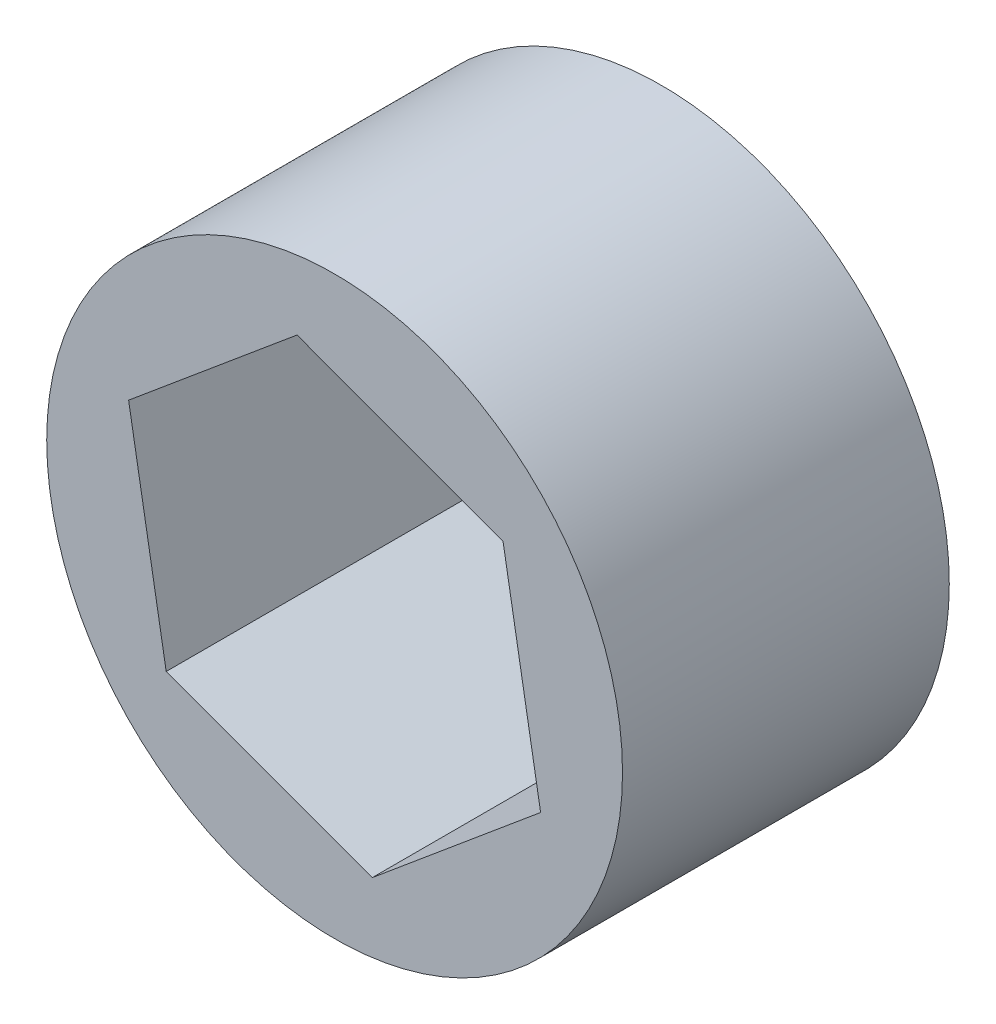
ISO-10303-21;
HEADER;
FILE_DESCRIPTION(('STEP AP214'),'2;1');
FILE_NAME('part.step','',(''),(''),'','','');
FILE_SCHEMA(('AUTOMOTIVE_DESIGN { 1 0 10303 214 1 1 1 1 }'));
ENDSEC;
DATA;
#1=APPLICATION_CONTEXT('core data for automotive mechanical design processes');
#2=APPLICATION_PROTOCOL_DEFINITION('international standard','automotive_design',2000,#1);
#3=PRODUCT_CONTEXT('',#1,'mechanical');
#4=PRODUCT('Part','Part','',(#3));
#5=PRODUCT_RELATED_PRODUCT_CATEGORY('part','',(#4));
#6=PRODUCT_DEFINITION_FORMATION('','',#4);
#7=PRODUCT_DEFINITION_CONTEXT('part definition',#1,'design');
#8=PRODUCT_DEFINITION('design','',#6,#7);
#9=PRODUCT_DEFINITION_SHAPE('','',#8);
#10=(LENGTH_UNIT() NAMED_UNIT(*) SI_UNIT(.MILLI.,.METRE.));
#11=(NAMED_UNIT(*) PLANE_ANGLE_UNIT() SI_UNIT($,.RADIAN.));
#12=(NAMED_UNIT(*) SI_UNIT($,.STERADIAN.) SOLID_ANGLE_UNIT());
#13=UNCERTAINTY_MEASURE_WITH_UNIT(LENGTH_MEASURE(1.E-05),#10,'distance_accuracy_value','');
#14=(GEOMETRIC_REPRESENTATION_CONTEXT(3) GLOBAL_UNCERTAINTY_ASSIGNED_CONTEXT((#13)) GLOBAL_UNIT_ASSIGNED_CONTEXT((#10,
#11,#12)) REPRESENTATION_CONTEXT('',''));
#15=CARTESIAN_POINT('',(0.,0.,0.));
#16=DIRECTION('',(0.,0.,1.));
#17=DIRECTION('',(1.,0.,0.));
#18=AXIS2_PLACEMENT_3D('',#15,#16,#17);
#19=CARTESIAN_POINT('',(0.,0.,11.35));
#20=DIRECTION('',(0.,0.,1.));
#21=DIRECTION('',(1.,0.,0.));
#22=AXIS2_PLACEMENT_3D('',#19,#20,#21);
#23=PLANE('',#22);
#24=CARTESIAN_POINT('',(0.,0.,11.35));
#25=DIRECTION('',(0.,0.,1.));
#26=DIRECTION('',(1.,0.,0.));
#27=AXIS2_PLACEMENT_3D('',#24,#25,#26);
#28=CIRCLE('',#27,9.999999939);
#29=CARTESIAN_POINT('',(9.999999939,0.,11.35));
#30=VERTEX_POINT('',#29);
#31=EDGE_CURVE('E11',#30,#30,#28,.T.);
#32=ORIENTED_EDGE('',*,*,#31,.T.);
#33=EDGE_LOOP('',(#32));
#34=FACE_BOUND('',#33,.T.);
#35=DIRECTION('',(0.171304886401219,-0.985218065148556,0.));
#36=VECTOR('',#35,1.);
#37=CARTESIAN_POINT('',(-7.15519851701027,2.62357278957036,11.35));
#38=LINE('',#37,#36);
#39=CARTESIAN_POINT('',(-7.15519851701027,2.62357278957036,11.35));
#40=VERTEX_POINT('',#39);
#41=CARTESIAN_POINT('',(-5.84967994295068,-4.88479729006646,11.35));
#42=VERTEX_POINT('',#41);
#43=EDGE_CURVE('E94',#40,#42,#38,.T.);
#44=ORIENTED_EDGE('',*,*,#43,.F.);
#45=DIRECTION('',(-0.767571429485392,-0.640963415990142,0.));
#46=VECTOR('',#45,1.);
#47=CARTESIAN_POINT('',(-1.3055185740596,7.50837007963682,11.35));
#48=LINE('',#47,#46);
#49=CARTESIAN_POINT('',(-1.3055185740596,7.50837007963682,11.35));
#50=VERTEX_POINT('',#49);
#51=EDGE_CURVE('E86',#50,#40,#48,.T.);
#52=ORIENTED_EDGE('',*,*,#51,.F.);
#53=DIRECTION('',(-0.938876315886612,0.344254649158415,0.));
#54=VECTOR('',#53,1.);
#55=CARTESIAN_POINT('',(5.84967994295067,4.88479729006646,11.35));
#56=LINE('',#55,#54);
#57=CARTESIAN_POINT('',(5.84967994295067,4.88479729006646,11.35));
#58=VERTEX_POINT('',#57);
#59=EDGE_CURVE('E114',#58,#50,#56,.T.);
#60=ORIENTED_EDGE('',*,*,#59,.F.);
#61=DIRECTION('',(-0.171304886401219,0.985218065148557,0.));
#62=VECTOR('',#61,1.);
#63=CARTESIAN_POINT('',(7.15519851701027,-2.62357278957036,11.35));
#64=LINE('',#63,#62);
#65=CARTESIAN_POINT('',(7.15519851701027,-2.62357278957036,11.35));
#66=VERTEX_POINT('',#65);
#67=EDGE_CURVE('E112',#66,#58,#64,.T.);
#68=ORIENTED_EDGE('',*,*,#67,.F.);
#69=DIRECTION('',(0.767571429485392,0.640963415990142,0.));
#70=VECTOR('',#69,1.);
#71=CARTESIAN_POINT('',(1.30551857405959,-7.50837007963682,11.35));
#72=LINE('',#71,#70);
#73=CARTESIAN_POINT('',(1.30551857405959,-7.50837007963682,11.35));
#74=VERTEX_POINT('',#73);
#75=EDGE_CURVE('E108',#74,#66,#72,.T.);
#76=ORIENTED_EDGE('',*,*,#75,.F.);
#77=DIRECTION('',(0.938876315886612,-0.344254649158415,0.));
#78=VECTOR('',#77,1.);
#79=CARTESIAN_POINT('',(-5.84967994295068,-4.88479729006646,11.35));
#80=LINE('',#79,#78);
#81=EDGE_CURVE('E106',#42,#74,#80,.T.);
#82=ORIENTED_EDGE('',*,*,#81,.F.);
#83=EDGE_LOOP('',(#44,#52,#60,#68,#76,#82));
#84=FACE_BOUND('',#83,.T.);
#85=ADVANCED_FACE('F33',(#34,#84),#23,.T.);
#86=CARTESIAN_POINT('',(0.,0.,0.));
#87=DIRECTION('',(0.,0.,1.));
#88=DIRECTION('',(1.,0.,0.));
#89=AXIS2_PLACEMENT_3D('',#86,#87,#88);
#90=PLANE('',#89);
#91=CARTESIAN_POINT('',(0.,0.,0.));
#92=DIRECTION('',(0.,0.,1.));
#93=DIRECTION('',(1.,0.,0.));
#94=AXIS2_PLACEMENT_3D('',#91,#92,#93);
#95=CIRCLE('',#94,9.999999939);
#96=CARTESIAN_POINT('',(9.999999939,0.,0.));
#97=VERTEX_POINT('',#96);
#98=EDGE_CURVE('E37',#97,#97,#95,.T.);
#99=ORIENTED_EDGE('',*,*,#98,.F.);
#100=EDGE_LOOP('',(#99));
#101=FACE_BOUND('',#100,.T.);
#102=DIRECTION('',(-0.767571429485392,-0.640963415990142,0.));
#103=VECTOR('',#102,1.);
#104=CARTESIAN_POINT('',(-1.3055185740596,7.50837007963682,0.));
#105=LINE('',#104,#103);
#106=CARTESIAN_POINT('',(-1.3055185740596,7.50837007963682,0.));
#107=VERTEX_POINT('',#106);
#108=CARTESIAN_POINT('',(-7.15519851701027,2.62357278957036,0.));
#109=VERTEX_POINT('',#108);
#110=EDGE_CURVE('E56',#107,#109,#105,.T.);
#111=ORIENTED_EDGE('',*,*,#110,.T.);
#112=DIRECTION('',(0.171304886401219,-0.985218065148556,0.));
#113=VECTOR('',#112,1.);
#114=CARTESIAN_POINT('',(-7.15519851701027,2.62357278957036,0.));
#115=LINE('',#114,#113);
#116=CARTESIAN_POINT('',(-5.84967994295068,-4.88479729006646,0.));
#117=VERTEX_POINT('',#116);
#118=EDGE_CURVE('E101',#109,#117,#115,.T.);
#119=ORIENTED_EDGE('',*,*,#118,.T.);
#120=DIRECTION('',(0.938876315886612,-0.344254649158415,0.));
#121=VECTOR('',#120,1.);
#122=CARTESIAN_POINT('',(-5.84967994295068,-4.88479729006646,0.));
#123=LINE('',#122,#121);
#124=CARTESIAN_POINT('',(1.30551857405959,-7.50837007963682,0.));
#125=VERTEX_POINT('',#124);
#126=EDGE_CURVE('E118',#117,#125,#123,.T.);
#127=ORIENTED_EDGE('',*,*,#126,.T.);
#128=DIRECTION('',(0.767571429485392,0.640963415990142,0.));
#129=VECTOR('',#128,1.);
#130=CARTESIAN_POINT('',(1.30551857405959,-7.50837007963682,0.));
#131=LINE('',#130,#129);
#132=CARTESIAN_POINT('',(7.15519851701027,-2.62357278957036,0.));
#133=VERTEX_POINT('',#132);
#134=EDGE_CURVE('E121',#125,#133,#131,.T.);
#135=ORIENTED_EDGE('',*,*,#134,.T.);
#136=DIRECTION('',(-0.171304886401219,0.985218065148557,0.));
#137=VECTOR('',#136,1.);
#138=CARTESIAN_POINT('',(7.15519851701027,-2.62357278957036,0.));
#139=LINE('',#138,#137);
#140=CARTESIAN_POINT('',(5.84967994295067,4.88479729006646,0.));
#141=VERTEX_POINT('',#140);
#142=EDGE_CURVE('E124',#133,#141,#139,.T.);
#143=ORIENTED_EDGE('',*,*,#142,.T.);
#144=DIRECTION('',(-0.938876315886612,0.344254649158415,0.));
#145=VECTOR('',#144,1.);
#146=CARTESIAN_POINT('',(5.84967994295067,4.88479729006646,0.));
#147=LINE('',#146,#145);
#148=EDGE_CURVE('E95',#141,#107,#147,.T.);
#149=ORIENTED_EDGE('',*,*,#148,.T.);
#150=EDGE_LOOP('',(#111,#119,#127,#135,#143,#149));
#151=FACE_BOUND('',#150,.T.);
#152=ADVANCED_FACE('F141',(#101,#151),#90,.F.);
#153=CARTESIAN_POINT('',(0.,0.,11.35));
#154=DIRECTION('',(0.,0.,-1.));
#155=DIRECTION('',(-1.,0.,0.));
#156=AXIS2_PLACEMENT_3D('',#153,#154,#155);
#157=CYLINDRICAL_SURFACE('',#156,9.999999939);
#158=ORIENTED_EDGE('',*,*,#31,.F.);
#159=EDGE_LOOP('',(#158));
#160=FACE_BOUND('',#159,.T.);
#161=ORIENTED_EDGE('',*,*,#98,.T.);
#162=EDGE_LOOP('',(#161));
#163=FACE_BOUND('',#162,.T.);
#164=ADVANCED_FACE('F35',(#160,#163),#157,.T.);
#165=CARTESIAN_POINT('',(-1.3055185740596,7.50837007963682,11.35));
#166=DIRECTION('',(0.640963415990142,-0.767571429485392,0.));
#167=DIRECTION('',(0.767571429485392,0.640963415990142,0.));
#168=AXIS2_PLACEMENT_3D('',#165,#166,#167);
#169=PLANE('',#168);
#170=ORIENTED_EDGE('',*,*,#110,.F.);
#171=DIRECTION('',(0.,0.,-1.));
#172=VECTOR('',#171,1.);
#173=CARTESIAN_POINT('',(-1.3055185740596,7.50837007963682,11.35));
#174=LINE('',#173,#172);
#175=EDGE_CURVE('E90',#50,#107,#174,.T.);
#176=ORIENTED_EDGE('',*,*,#175,.F.);
#177=ORIENTED_EDGE('',*,*,#51,.T.);
#178=DIRECTION('',(0.,0.,-1.));
#179=VECTOR('',#178,1.);
#180=CARTESIAN_POINT('',(-7.15519851701027,2.62357278957036,11.35));
#181=LINE('',#180,#179);
#182=EDGE_CURVE('E89',#40,#109,#181,.T.);
#183=ORIENTED_EDGE('',*,*,#182,.T.);
#184=EDGE_LOOP('',(#170,#176,#177,#183));
#185=FACE_BOUND('',#184,.T.);
#186=ADVANCED_FACE('F88',(#185),#169,.T.);
#187=CARTESIAN_POINT('',(-7.15519851701027,2.62357278957036,11.35));
#188=DIRECTION('',(0.985218065148556,0.171304886401219,0.));
#189=DIRECTION('',(-0.171304886401219,0.985218065148557,0.));
#190=AXIS2_PLACEMENT_3D('',#187,#188,#189);
#191=PLANE('',#190);
#192=ORIENTED_EDGE('',*,*,#118,.F.);
#193=ORIENTED_EDGE('',*,*,#182,.F.);
#194=ORIENTED_EDGE('',*,*,#43,.T.);
#195=DIRECTION('',(0.,0.,-1.));
#196=VECTOR('',#195,1.);
#197=CARTESIAN_POINT('',(-5.84967994295068,-4.88479729006646,11.35));
#198=LINE('',#197,#196);
#199=EDGE_CURVE('E102',#42,#117,#198,.T.);
#200=ORIENTED_EDGE('',*,*,#199,.T.);
#201=EDGE_LOOP('',(#192,#193,#194,#200));
#202=FACE_BOUND('',#201,.T.);
#203=ADVANCED_FACE('F98',(#202),#191,.T.);
#204=CARTESIAN_POINT('',(-5.84967994295068,-4.88479729006646,11.35));
#205=DIRECTION('',(0.344254649158415,0.938876315886612,0.));
#206=DIRECTION('',(-0.938876315886612,0.344254649158415,0.));
#207=AXIS2_PLACEMENT_3D('',#204,#205,#206);
#208=PLANE('',#207);
#209=ORIENTED_EDGE('',*,*,#126,.F.);
#210=ORIENTED_EDGE('',*,*,#199,.F.);
#211=ORIENTED_EDGE('',*,*,#81,.T.);
#212=DIRECTION('',(0.,0.,-1.));
#213=VECTOR('',#212,1.);
#214=CARTESIAN_POINT('',(1.30551857405959,-7.50837007963682,11.35));
#215=LINE('',#214,#213);
#216=EDGE_CURVE('E133',#74,#125,#215,.T.);
#217=ORIENTED_EDGE('',*,*,#216,.T.);
#218=EDGE_LOOP('',(#209,#210,#211,#217));
#219=FACE_BOUND('',#218,.T.);
#220=ADVANCED_FACE('F137',(#219),#208,.T.);
#221=CARTESIAN_POINT('',(1.30551857405959,-7.50837007963682,11.35));
#222=DIRECTION('',(-0.640963415990142,0.767571429485392,0.));
#223=DIRECTION('',(-0.767571429485392,-0.640963415990142,0.));
#224=AXIS2_PLACEMENT_3D('',#221,#222,#223);
#225=PLANE('',#224);
#226=ORIENTED_EDGE('',*,*,#134,.F.);
#227=ORIENTED_EDGE('',*,*,#216,.F.);
#228=ORIENTED_EDGE('',*,*,#75,.T.);
#229=DIRECTION('',(0.,0.,-1.));
#230=VECTOR('',#229,1.);
#231=CARTESIAN_POINT('',(7.15519851701027,-2.62357278957036,11.35));
#232=LINE('',#231,#230);
#233=EDGE_CURVE('E131',#66,#133,#232,.T.);
#234=ORIENTED_EDGE('',*,*,#233,.T.);
#235=EDGE_LOOP('',(#226,#227,#228,#234));
#236=FACE_BOUND('',#235,.T.);
#237=ADVANCED_FACE('F149',(#236),#225,.T.);
#238=CARTESIAN_POINT('',(7.15519851701027,-2.62357278957036,11.35));
#239=DIRECTION('',(-0.985218065148556,-0.171304886401219,0.));
#240=DIRECTION('',(0.171304886401219,-0.985218065148557,0.));
#241=AXIS2_PLACEMENT_3D('',#238,#239,#240);
#242=PLANE('',#241);
#243=ORIENTED_EDGE('',*,*,#142,.F.);
#244=ORIENTED_EDGE('',*,*,#233,.F.);
#245=ORIENTED_EDGE('',*,*,#67,.T.);
#246=DIRECTION('',(0.,0.,-1.));
#247=VECTOR('',#246,1.);
#248=CARTESIAN_POINT('',(5.84967994295067,4.88479729006646,11.35));
#249=LINE('',#248,#247);
#250=EDGE_CURVE('E48',#58,#141,#249,.T.);
#251=ORIENTED_EDGE('',*,*,#250,.T.);
#252=EDGE_LOOP('',(#243,#244,#245,#251));
#253=FACE_BOUND('',#252,.T.);
#254=ADVANCED_FACE('F147',(#253),#242,.T.);
#255=CARTESIAN_POINT('',(5.84967994295067,4.88479729006646,11.35));
#256=DIRECTION('',(-0.344254649158415,-0.938876315886612,0.));
#257=DIRECTION('',(0.938876315886612,-0.344254649158415,0.));
#258=AXIS2_PLACEMENT_3D('',#255,#256,#257);
#259=PLANE('',#258);
#260=ORIENTED_EDGE('',*,*,#148,.F.);
#261=ORIENTED_EDGE('',*,*,#250,.F.);
#262=ORIENTED_EDGE('',*,*,#59,.T.);
#263=ORIENTED_EDGE('',*,*,#175,.T.);
#264=EDGE_LOOP('',(#260,#261,#262,#263));
#265=FACE_BOUND('',#264,.T.);
#266=ADVANCED_FACE('F143',(#265),#259,.T.);
#267=CLOSED_SHELL('',(#85,#152,#164,#186,#203,#220,#237,#254,#266));
#268=MANIFOLD_SOLID_BREP('B2',#267);
#269=ADVANCED_BREP_SHAPE_REPRESENTATION('',(#18,#268),#14);
#270=SHAPE_DEFINITION_REPRESENTATION(#9,#269);
ENDSEC;
END-ISO-10303-21;
